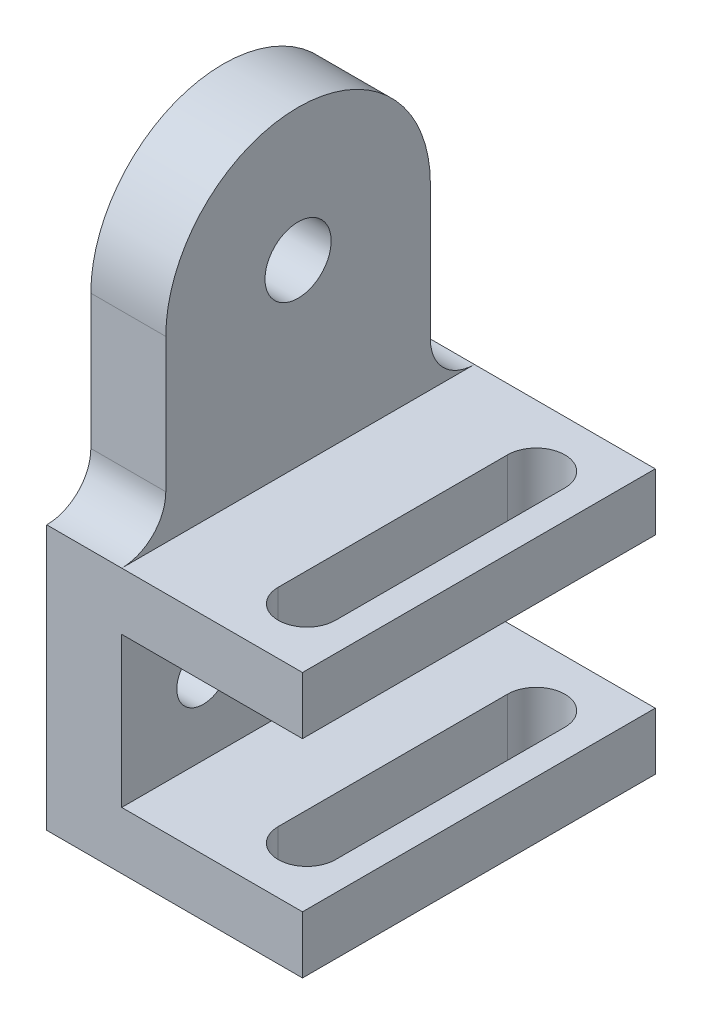
ISO-10303-21;
HEADER;
FILE_DESCRIPTION(('STEP AP214'),'2;1');
FILE_NAME('part.step','',(''),(''),'','','');
FILE_SCHEMA(('AUTOMOTIVE_DESIGN { 1 0 10303 214 1 1 1 1 }'));
ENDSEC;
DATA;
#1=APPLICATION_CONTEXT('core data for automotive mechanical design processes');
#2=APPLICATION_PROTOCOL_DEFINITION('international standard','automotive_design',2000,#1);
#3=PRODUCT_CONTEXT('',#1,'mechanical');
#4=PRODUCT('Part','Part','',(#3));
#5=PRODUCT_RELATED_PRODUCT_CATEGORY('part','',(#4));
#6=PRODUCT_DEFINITION_FORMATION('','',#4);
#7=PRODUCT_DEFINITION_CONTEXT('part definition',#1,'design');
#8=PRODUCT_DEFINITION('design','',#6,#7);
#9=PRODUCT_DEFINITION_SHAPE('','',#8);
#10=(LENGTH_UNIT() NAMED_UNIT(*) SI_UNIT(.MILLI.,.METRE.));
#11=(NAMED_UNIT(*) PLANE_ANGLE_UNIT() SI_UNIT($,.RADIAN.));
#12=(NAMED_UNIT(*) SI_UNIT($,.STERADIAN.) SOLID_ANGLE_UNIT());
#13=UNCERTAINTY_MEASURE_WITH_UNIT(LENGTH_MEASURE(1.E-05),#10,'distance_accuracy_value','');
#14=(GEOMETRIC_REPRESENTATION_CONTEXT(3) GLOBAL_UNCERTAINTY_ASSIGNED_CONTEXT((#13)) GLOBAL_UNIT_ASSIGNED_CONTEXT((#10,
#11,#12)) REPRESENTATION_CONTEXT('',''));
#15=CARTESIAN_POINT('',(0.,0.,0.));
#16=DIRECTION('',(0.,0.,1.));
#17=DIRECTION('',(1.,0.,0.));
#18=AXIS2_PLACEMENT_3D('',#15,#16,#17);
#19=CARTESIAN_POINT('',(17.,0.,0.));
#20=DIRECTION('',(0.,0.,-1.));
#21=DIRECTION('',(-1.,0.,0.));
#22=AXIS2_PLACEMENT_3D('',#19,#20,#21);
#23=PLANE('',#22);
#24=DIRECTION('',(0.,-1.,0.));
#25=VECTOR('',#24,1.);
#26=CARTESIAN_POINT('',(0.,0.,0.));
#27=LINE('',#26,#25);
#28=CARTESIAN_POINT('',(0.,0.,0.));
#29=VERTEX_POINT('',#28);
#30=CARTESIAN_POINT('',(0.,-60.,0.));
#31=VERTEX_POINT('',#30);
#32=EDGE_CURVE('E156',#29,#31,#27,.T.);
#33=ORIENTED_EDGE('',*,*,#32,.T.);
#34=DIRECTION('',(-1.,0.,0.));
#35=VECTOR('',#34,1.);
#36=CARTESIAN_POINT('',(17.,-60.,0.));
#37=LINE('',#36,#35);
#38=CARTESIAN_POINT('',(17.,-60.,0.));
#39=VERTEX_POINT('',#38);
#40=EDGE_CURVE('E12',#39,#31,#37,.T.);
#41=ORIENTED_EDGE('',*,*,#40,.F.);
#42=DIRECTION('',(0.,-1.,0.));
#43=VECTOR('',#42,1.);
#44=CARTESIAN_POINT('',(17.,0.,0.));
#45=LINE('',#44,#43);
#46=CARTESIAN_POINT('',(17.,0.,0.));
#47=VERTEX_POINT('',#46);
#48=EDGE_CURVE('E67',#47,#39,#45,.T.);
#49=ORIENTED_EDGE('',*,*,#48,.F.);
#50=DIRECTION('',(-1.,0.,0.));
#51=VECTOR('',#50,1.);
#52=CARTESIAN_POINT('',(17.,0.,0.));
#53=LINE('',#52,#51);
#54=EDGE_CURVE('E52',#47,#29,#53,.T.);
#55=ORIENTED_EDGE('',*,*,#54,.T.);
#56=EDGE_LOOP('',(#33,#41,#49,#55));
#57=FACE_BOUND('',#56,.T.);
#58=ADVANCED_FACE('F49',(#57),#23,.F.);
#59=CARTESIAN_POINT('',(17.,-60.,0.));
#60=DIRECTION('',(0.,-1.,0.));
#61=DIRECTION('',(1.,0.,0.));
#62=AXIS2_PLACEMENT_3D('',#59,#60,#61);
#63=PLANE('',#62);
#64=DIRECTION('',(0.,0.,1.));
#65=VECTOR('',#64,1.);
#66=CARTESIAN_POINT('',(0.,-60.,0.));
#67=LINE('',#66,#65);
#68=CARTESIAN_POINT('',(0.,-60.,-40.));
#69=VERTEX_POINT('',#68);
#70=EDGE_CURVE('E173',#69,#31,#67,.T.);
#71=ORIENTED_EDGE('',*,*,#70,.F.);
#72=DIRECTION('',(-1.,0.,0.));
#73=VECTOR('',#72,1.);
#74=CARTESIAN_POINT('',(17.,-60.,-40.));
#75=LINE('',#74,#73);
#76=CARTESIAN_POINT('',(17.,-60.,-40.));
#77=VERTEX_POINT('',#76);
#78=EDGE_CURVE('E58',#77,#69,#75,.T.);
#79=ORIENTED_EDGE('',*,*,#78,.F.);
#80=DIRECTION('',(0.,0.,1.));
#81=VECTOR('',#80,1.);
#82=CARTESIAN_POINT('',(17.,-60.,0.));
#83=LINE('',#82,#81);
#84=EDGE_CURVE('E145',#77,#39,#83,.T.);
#85=ORIENTED_EDGE('',*,*,#84,.T.);
#86=ORIENTED_EDGE('',*,*,#40,.T.);
#87=EDGE_LOOP('',(#71,#79,#85,#86));
#88=FACE_BOUND('',#87,.T.);
#89=ADVANCED_FACE('F202',(#88),#63,.T.);
#90=CARTESIAN_POINT('',(17.,0.,-40.));
#91=DIRECTION('',(0.,0.,-1.));
#92=DIRECTION('',(-1.,0.,0.));
#93=AXIS2_PLACEMENT_3D('',#90,#91,#92);
#94=PLANE('',#93);
#95=DIRECTION('',(0.,-1.,0.));
#96=VECTOR('',#95,1.);
#97=CARTESIAN_POINT('',(0.,0.,-40.));
#98=LINE('',#97,#96);
#99=CARTESIAN_POINT('',(0.,0.,-40.));
#100=VERTEX_POINT('',#99);
#101=EDGE_CURVE('E130',#100,#69,#98,.T.);
#102=ORIENTED_EDGE('',*,*,#101,.F.);
#103=DIRECTION('',(-1.,0.,0.));
#104=VECTOR('',#103,1.);
#105=CARTESIAN_POINT('',(17.,0.,-40.));
#106=LINE('',#105,#104);
#107=CARTESIAN_POINT('',(17.,0.,-40.));
#108=VERTEX_POINT('',#107);
#109=EDGE_CURVE('E125',#108,#100,#106,.T.);
#110=ORIENTED_EDGE('',*,*,#109,.F.);
#111=DIRECTION('',(0.,-1.,0.));
#112=VECTOR('',#111,1.);
#113=CARTESIAN_POINT('',(17.,0.,-40.));
#114=LINE('',#113,#112);
#115=EDGE_CURVE('E129',#108,#77,#114,.T.);
#116=ORIENTED_EDGE('',*,*,#115,.T.);
#117=ORIENTED_EDGE('',*,*,#78,.T.);
#118=EDGE_LOOP('',(#102,#110,#116,#117));
#119=FACE_BOUND('',#118,.T.);
#120=ADVANCED_FACE('F127',(#119),#94,.T.);
#121=CARTESIAN_POINT('',(17.,10.,-40.));
#122=DIRECTION('',(-1.,0.,0.));
#123=DIRECTION('',(0.,-1.,0.));
#124=AXIS2_PLACEMENT_3D('',#121,#122,#123);
#125=CYLINDRICAL_SURFACE('',#124,9.99999999999999);
#126=CARTESIAN_POINT('',(0.,10.,-40.));
#127=DIRECTION('',(-1.,0.,0.));
#128=DIRECTION('',(0.,-1.,0.));
#129=AXIS2_PLACEMENT_3D('',#126,#127,#128);
#130=CIRCLE('',#129,9.99999999999999);
#131=CARTESIAN_POINT('',(0.,10.0000000000001,-30.));
#132=VERTEX_POINT('',#131);
#133=EDGE_CURVE('E170',#100,#132,#130,.T.);
#134=ORIENTED_EDGE('',*,*,#133,.T.);
#135=DIRECTION('',(-1.,0.,0.));
#136=VECTOR('',#135,1.);
#137=CARTESIAN_POINT('',(17.,10.0000000000001,-30.));
#138=LINE('',#137,#136);
#139=CARTESIAN_POINT('',(17.,10.0000000000001,-30.));
#140=VERTEX_POINT('',#139);
#141=EDGE_CURVE('E134',#140,#132,#138,.T.);
#142=ORIENTED_EDGE('',*,*,#141,.F.);
#143=CARTESIAN_POINT('',(17.,10.,-40.));
#144=DIRECTION('',(-1.,0.,0.));
#145=DIRECTION('',(0.,-1.,0.));
#146=AXIS2_PLACEMENT_3D('',#143,#144,#145);
#147=CIRCLE('',#146,9.99999999999999);
#148=EDGE_CURVE('E137',#108,#140,#147,.T.);
#149=ORIENTED_EDGE('',*,*,#148,.F.);
#150=ORIENTED_EDGE('',*,*,#109,.T.);
#151=EDGE_LOOP('',(#134,#142,#149,#150));
#152=FACE_BOUND('',#151,.T.);
#153=ADVANCED_FACE('F138',(#152),#125,.F.);
#154=CARTESIAN_POINT('',(17.,0.,-30.));
#155=DIRECTION('',(0.,0.,-1.));
#156=DIRECTION('',(-1.,0.,0.));
#157=AXIS2_PLACEMENT_3D('',#154,#155,#156);
#158=PLANE('',#157);
#159=DIRECTION('',(0.,-1.,0.));
#160=VECTOR('',#159,1.);
#161=CARTESIAN_POINT('',(0.,0.,-30.));
#162=LINE('',#161,#160);
#163=CARTESIAN_POINT('',(0.,40.5,-30.));
#164=VERTEX_POINT('',#163);
#165=EDGE_CURVE('E167',#164,#132,#162,.T.);
#166=ORIENTED_EDGE('',*,*,#165,.F.);
#167=DIRECTION('',(-1.,0.,0.));
#168=VECTOR('',#167,1.);
#169=CARTESIAN_POINT('',(17.,40.5,-30.));
#170=LINE('',#169,#168);
#171=CARTESIAN_POINT('',(17.,40.5,-30.));
#172=VERTEX_POINT('',#171);
#173=EDGE_CURVE('E184',#172,#164,#170,.T.);
#174=ORIENTED_EDGE('',*,*,#173,.F.);
#175=DIRECTION('',(0.,-1.,0.));
#176=VECTOR('',#175,1.);
#177=CARTESIAN_POINT('',(17.,0.,-30.));
#178=LINE('',#177,#176);
#179=EDGE_CURVE('E141',#172,#140,#178,.T.);
#180=ORIENTED_EDGE('',*,*,#179,.T.);
#181=ORIENTED_EDGE('',*,*,#141,.T.);
#182=EDGE_LOOP('',(#166,#174,#180,#181));
#183=FACE_BOUND('',#182,.T.);
#184=ADVANCED_FACE('F216',(#183),#158,.T.);
#185=CARTESIAN_POINT('',(17.,40.5,0.));
#186=DIRECTION('',(-1.,0.,0.));
#187=DIRECTION('',(0.,-1.,0.));
#188=AXIS2_PLACEMENT_3D('',#185,#186,#187);
#189=CYLINDRICAL_SURFACE('',#188,30.);
#190=CARTESIAN_POINT('',(0.,40.5,0.));
#191=DIRECTION('',(-1.,0.,0.));
#192=DIRECTION('',(0.,-1.,0.));
#193=AXIS2_PLACEMENT_3D('',#190,#191,#192);
#194=CIRCLE('',#193,30.);
#195=CARTESIAN_POINT('',(0.,40.5,30.));
#196=VERTEX_POINT('',#195);
#197=EDGE_CURVE('E164',#196,#164,#194,.T.);
#198=ORIENTED_EDGE('',*,*,#197,.F.);
#199=DIRECTION('',(-1.,0.,0.));
#200=VECTOR('',#199,1.);
#201=CARTESIAN_POINT('',(17.,40.5,30.));
#202=LINE('',#201,#200);
#203=CARTESIAN_POINT('',(17.,40.5,30.));
#204=VERTEX_POINT('',#203);
#205=EDGE_CURVE('E186',#204,#196,#202,.T.);
#206=ORIENTED_EDGE('',*,*,#205,.F.);
#207=CARTESIAN_POINT('',(17.,40.5,0.));
#208=DIRECTION('',(-1.,0.,0.));
#209=DIRECTION('',(0.,-1.,0.));
#210=AXIS2_PLACEMENT_3D('',#207,#208,#209);
#211=CIRCLE('',#210,30.);
#212=EDGE_CURVE('E369',#204,#172,#211,.T.);
#213=ORIENTED_EDGE('',*,*,#212,.T.);
#214=ORIENTED_EDGE('',*,*,#173,.T.);
#215=EDGE_LOOP('',(#198,#206,#213,#214));
#216=FACE_BOUND('',#215,.T.);
#217=ADVANCED_FACE('F219',(#216),#189,.T.);
#218=CARTESIAN_POINT('',(17.,0.,30.));
#219=DIRECTION('',(0.,0.,-1.));
#220=DIRECTION('',(0.,1.,0.));
#221=AXIS2_PLACEMENT_3D('',#218,#219,#220);
#222=PLANE('',#221);
#223=DIRECTION('',(0.,-1.,0.));
#224=VECTOR('',#223,1.);
#225=CARTESIAN_POINT('',(0.,0.,30.));
#226=LINE('',#225,#224);
#227=CARTESIAN_POINT('',(0.,10.0000000000001,30.));
#228=VERTEX_POINT('',#227);
#229=EDGE_CURVE('E162',#196,#228,#226,.T.);
#230=ORIENTED_EDGE('',*,*,#229,.T.);
#231=DIRECTION('',(-1.,0.,0.));
#232=VECTOR('',#231,1.);
#233=CARTESIAN_POINT('',(17.,10.0000000000001,30.));
#234=LINE('',#233,#232);
#235=CARTESIAN_POINT('',(17.,10.0000000000001,30.));
#236=VERTEX_POINT('',#235);
#237=EDGE_CURVE('E188',#236,#228,#234,.T.);
#238=ORIENTED_EDGE('',*,*,#237,.F.);
#239=DIRECTION('',(0.,-1.,0.));
#240=VECTOR('',#239,1.);
#241=CARTESIAN_POINT('',(17.,0.,30.));
#242=LINE('',#241,#240);
#243=EDGE_CURVE('E370',#204,#236,#242,.T.);
#244=ORIENTED_EDGE('',*,*,#243,.F.);
#245=ORIENTED_EDGE('',*,*,#205,.T.);
#246=EDGE_LOOP('',(#230,#238,#244,#245));
#247=FACE_BOUND('',#246,.T.);
#248=ADVANCED_FACE('F223',(#247),#222,.F.);
#249=CARTESIAN_POINT('',(17.,10.,40.));
#250=DIRECTION('',(-1.,0.,0.));
#251=DIRECTION('',(0.,-1.,0.));
#252=AXIS2_PLACEMENT_3D('',#249,#250,#251);
#253=CYLINDRICAL_SURFACE('',#252,10.);
#254=CARTESIAN_POINT('',(0.,10.,40.));
#255=DIRECTION('',(-1.,0.,0.));
#256=DIRECTION('',(0.,-1.,0.));
#257=AXIS2_PLACEMENT_3D('',#254,#255,#256);
#258=CIRCLE('',#257,10.);
#259=CARTESIAN_POINT('',(0.,0.,40.));
#260=VERTEX_POINT('',#259);
#261=EDGE_CURVE('E160',#228,#260,#258,.T.);
#262=ORIENTED_EDGE('',*,*,#261,.T.);
#263=DIRECTION('',(-1.,0.,0.));
#264=VECTOR('',#263,1.);
#265=CARTESIAN_POINT('',(17.,0.,40.));
#266=LINE('',#265,#264);
#267=CARTESIAN_POINT('',(17.,0.,40.));
#268=VERTEX_POINT('',#267);
#269=EDGE_CURVE('E190',#268,#260,#266,.T.);
#270=ORIENTED_EDGE('',*,*,#269,.F.);
#271=CARTESIAN_POINT('',(17.,10.,40.));
#272=DIRECTION('',(-1.,0.,0.));
#273=DIRECTION('',(0.,-1.,0.));
#274=AXIS2_PLACEMENT_3D('',#271,#272,#273);
#275=CIRCLE('',#274,10.);
#276=EDGE_CURVE('E374',#236,#268,#275,.T.);
#277=ORIENTED_EDGE('',*,*,#276,.F.);
#278=ORIENTED_EDGE('',*,*,#237,.T.);
#279=EDGE_LOOP('',(#262,#270,#277,#278));
#280=FACE_BOUND('',#279,.T.);
#281=ADVANCED_FACE('F227',(#280),#253,.F.);
#282=CARTESIAN_POINT('',(17.,-30.,-21.5));
#283=DIRECTION('',(-1.,0.,0.));
#284=DIRECTION('',(0.,-1.,0.));
#285=AXIS2_PLACEMENT_3D('',#282,#283,#284);
#286=CYLINDRICAL_SURFACE('',#285,6.);
#287=CARTESIAN_POINT('',(17.,-30.,-21.5));
#288=DIRECTION('',(-1.,0.,0.));
#289=DIRECTION('',(0.,-1.,0.));
#290=AXIS2_PLACEMENT_3D('',#287,#288,#289);
#291=CIRCLE('',#290,6.);
#292=CARTESIAN_POINT('',(17.,-36.,-21.5));
#293=VERTEX_POINT('',#292);
#294=EDGE_CURVE('E147',#293,#293,#291,.T.);
#295=ORIENTED_EDGE('',*,*,#294,.F.);
#296=EDGE_LOOP('',(#295));
#297=FACE_BOUND('',#296,.T.);
#298=CARTESIAN_POINT('',(0.,-30.,-21.5));
#299=DIRECTION('',(-1.,0.,0.));
#300=DIRECTION('',(0.,-1.,0.));
#301=AXIS2_PLACEMENT_3D('',#298,#299,#300);
#302=CIRCLE('',#301,6.);
#303=CARTESIAN_POINT('',(0.,-36.,-21.5));
#304=VERTEX_POINT('',#303);
#305=EDGE_CURVE('E176',#304,#304,#302,.T.);
#306=ORIENTED_EDGE('',*,*,#305,.T.);
#307=EDGE_LOOP('',(#306));
#308=FACE_BOUND('',#307,.T.);
#309=ADVANCED_FACE('F211',(#297,#308),#286,.F.);
#310=CARTESIAN_POINT('',(17.,0.,0.));
#311=DIRECTION('',(0.,1.,0.));
#312=DIRECTION('',(-1.,0.,0.));
#313=AXIS2_PLACEMENT_3D('',#310,#311,#312);
#314=PLANE('',#313);
#315=DIRECTION('',(0.,0.,-1.));
#316=VECTOR('',#315,1.);
#317=CARTESIAN_POINT('',(0.,0.,0.));
#318=LINE('',#317,#316);
#319=EDGE_CURVE('E158',#260,#29,#318,.T.);
#320=ORIENTED_EDGE('',*,*,#319,.T.);
#321=ORIENTED_EDGE('',*,*,#54,.F.);
#322=DIRECTION('',(0.,0.,-1.));
#323=VECTOR('',#322,1.);
#324=CARTESIAN_POINT('',(17.,0.,0.));
#325=LINE('',#324,#323);
#326=EDGE_CURVE('E109',#268,#47,#325,.T.);
#327=ORIENTED_EDGE('',*,*,#326,.F.);
#328=ORIENTED_EDGE('',*,*,#269,.T.);
#329=EDGE_LOOP('',(#320,#321,#327,#328));
#330=FACE_BOUND('',#329,.T.);
#331=ADVANCED_FACE('F231',(#330),#314,.F.);
#332=CARTESIAN_POINT('',(17.,40.5,0.));
#333=DIRECTION('',(-1.,0.,0.));
#334=DIRECTION('',(0.,-1.,0.));
#335=AXIS2_PLACEMENT_3D('',#332,#333,#334);
#336=CYLINDRICAL_SURFACE('',#335,7.5);
#337=CARTESIAN_POINT('',(17.,40.5,0.));
#338=DIRECTION('',(-1.,0.,0.));
#339=DIRECTION('',(0.,-1.,0.));
#340=AXIS2_PLACEMENT_3D('',#337,#338,#339);
#341=CIRCLE('',#340,7.5);
#342=CARTESIAN_POINT('',(17.,33.,0.));
#343=VERTEX_POINT('',#342);
#344=EDGE_CURVE('E153',#343,#343,#341,.T.);
#345=ORIENTED_EDGE('',*,*,#344,.F.);
#346=EDGE_LOOP('',(#345));
#347=FACE_BOUND('',#346,.T.);
#348=CARTESIAN_POINT('',(0.,40.5,0.));
#349=DIRECTION('',(-1.,0.,0.));
#350=DIRECTION('',(0.,-1.,0.));
#351=AXIS2_PLACEMENT_3D('',#348,#349,#350);
#352=CIRCLE('',#351,7.5);
#353=CARTESIAN_POINT('',(0.,33.,0.));
#354=VERTEX_POINT('',#353);
#355=EDGE_CURVE('E179',#354,#354,#352,.T.);
#356=ORIENTED_EDGE('',*,*,#355,.T.);
#357=EDGE_LOOP('',(#356));
#358=FACE_BOUND('',#357,.T.);
#359=ADVANCED_FACE('F233',(#347,#358),#336,.F.);
#360=CARTESIAN_POINT('',(17.,0.,0.));
#361=DIRECTION('',(-1.,0.,0.));
#362=DIRECTION('',(0.,-1.,0.));
#363=AXIS2_PLACEMENT_3D('',#360,#361,#362);
#364=PLANE('',#363);
#365=ORIENTED_EDGE('',*,*,#48,.T.);
#366=ORIENTED_EDGE('',*,*,#84,.F.);
#367=ORIENTED_EDGE('',*,*,#115,.F.);
#368=ORIENTED_EDGE('',*,*,#148,.T.);
#369=ORIENTED_EDGE('',*,*,#179,.F.);
#370=ORIENTED_EDGE('',*,*,#212,.F.);
#371=ORIENTED_EDGE('',*,*,#243,.T.);
#372=ORIENTED_EDGE('',*,*,#276,.T.);
#373=ORIENTED_EDGE('',*,*,#326,.T.);
#374=EDGE_LOOP('',(#365,#366,#367,#368,#369,#370,#371,#372,#373));
#375=FACE_BOUND('',#374,.T.);
#376=ORIENTED_EDGE('',*,*,#294,.T.);
#377=EDGE_LOOP('',(#376));
#378=FACE_BOUND('',#377,.T.);
#379=ORIENTED_EDGE('',*,*,#344,.T.);
#380=EDGE_LOOP('',(#379));
#381=FACE_BOUND('',#380,.T.);
#382=ADVANCED_FACE('F143',(#375,#378,#381),#364,.F.);
#383=CARTESIAN_POINT('',(0.,0.,0.));
#384=DIRECTION('',(-1.,0.,0.));
#385=DIRECTION('',(0.,-1.,0.));
#386=AXIS2_PLACEMENT_3D('',#383,#384,#385);
#387=PLANE('',#386);
#388=ORIENTED_EDGE('',*,*,#32,.F.);
#389=ORIENTED_EDGE('',*,*,#319,.F.);
#390=ORIENTED_EDGE('',*,*,#261,.F.);
#391=ORIENTED_EDGE('',*,*,#229,.F.);
#392=ORIENTED_EDGE('',*,*,#197,.T.);
#393=ORIENTED_EDGE('',*,*,#165,.T.);
#394=ORIENTED_EDGE('',*,*,#133,.F.);
#395=ORIENTED_EDGE('',*,*,#101,.T.);
#396=ORIENTED_EDGE('',*,*,#70,.T.);
#397=EDGE_LOOP('',(#388,#389,#390,#391,#392,#393,#394,#395,#396));
#398=FACE_BOUND('',#397,.T.);
#399=ORIENTED_EDGE('',*,*,#305,.F.);
#400=EDGE_LOOP('',(#399));
#401=FACE_BOUND('',#400,.T.);
#402=ORIENTED_EDGE('',*,*,#355,.F.);
#403=EDGE_LOOP('',(#402));
#404=FACE_BOUND('',#403,.T.);
#405=ADVANCED_FACE('F199',(#398,#401,#404),#387,.T.);
#406=CLOSED_SHELL('',(#58,#89,#120,#153,#184,#217,#248,#281,#309,#331,#359,#382,#405));
#407=MANIFOLD_SOLID_BREP('B2',#406);
#408=CARTESIAN_POINT('',(58.,0.,40.));
#409=DIRECTION('',(0.,-1.,0.));
#410=DIRECTION('',(1.,0.,0.));
#411=AXIS2_PLACEMENT_3D('',#408,#409,#410);
#412=PLANE('',#411);
#413=CARTESIAN_POINT('',(45.,0.,26.));
#414=DIRECTION('',(0.,1.,0.));
#415=DIRECTION('',(-1.,0.,0.));
#416=AXIS2_PLACEMENT_3D('',#413,#414,#415);
#417=CIRCLE('',#416,6.50000000000001);
#418=CARTESIAN_POINT('',(38.5,0.,26.));
#419=VERTEX_POINT('',#418);
#420=CARTESIAN_POINT('',(51.5,0.,26.));
#421=VERTEX_POINT('',#420);
#422=EDGE_CURVE('E526',#419,#421,#417,.T.);
#423=ORIENTED_EDGE('',*,*,#422,.F.);
#424=DIRECTION('',(0.,0.,1.));
#425=VECTOR('',#424,1.);
#426=CARTESIAN_POINT('',(38.5,0.,0.));
#427=LINE('',#426,#425);
#428=CARTESIAN_POINT('',(38.5,0.,-26.));
#429=VERTEX_POINT('',#428);
#430=EDGE_CURVE('E394',#429,#419,#427,.T.);
#431=ORIENTED_EDGE('',*,*,#430,.F.);
#432=CARTESIAN_POINT('',(45.,0.,-26.));
#433=DIRECTION('',(0.,1.,0.));
#434=DIRECTION('',(-1.,0.,0.));
#435=AXIS2_PLACEMENT_3D('',#432,#433,#434);
#436=CIRCLE('',#435,6.50000000000001);
#437=CARTESIAN_POINT('',(51.5,0.,-26.));
#438=VERTEX_POINT('',#437);
#439=EDGE_CURVE('E517',#438,#429,#436,.T.);
#440=ORIENTED_EDGE('',*,*,#439,.F.);
#441=DIRECTION('',(0.,0.,1.));
#442=VECTOR('',#441,1.);
#443=CARTESIAN_POINT('',(51.5,0.,0.));
#444=LINE('',#443,#442);
#445=EDGE_CURVE('E520',#438,#421,#444,.T.);
#446=ORIENTED_EDGE('',*,*,#445,.T.);
#447=EDGE_LOOP('',(#423,#431,#440,#446));
#448=FACE_BOUND('',#447,.T.);
#449=DIRECTION('',(-1.,0.,0.));
#450=VECTOR('',#449,1.);
#451=CARTESIAN_POINT('',(58.,0.,-40.));
#452=LINE('',#451,#450);
#453=CARTESIAN_POINT('',(58.,0.,-40.));
#454=VERTEX_POINT('',#453);
#455=CARTESIAN_POINT('',(0.,0.,-40.));
#456=VERTEX_POINT('',#455);
#457=EDGE_CURVE('E573',#454,#456,#452,.T.);
#458=ORIENTED_EDGE('',*,*,#457,.T.);
#459=DIRECTION('',(0.,0.,-1.));
#460=VECTOR('',#459,1.);
#461=CARTESIAN_POINT('',(0.,0.,40.));
#462=LINE('',#461,#460);
#463=CARTESIAN_POINT('',(0.,0.,40.));
#464=VERTEX_POINT('',#463);
#465=EDGE_CURVE('E610',#464,#456,#462,.T.);
#466=ORIENTED_EDGE('',*,*,#465,.F.);
#467=DIRECTION('',(-1.,0.,0.));
#468=VECTOR('',#467,1.);
#469=CARTESIAN_POINT('',(58.,0.,40.));
#470=LINE('',#469,#468);
#471=CARTESIAN_POINT('',(58.,0.,40.));
#472=VERTEX_POINT('',#471);
#473=EDGE_CURVE('E554',#472,#464,#470,.T.);
#474=ORIENTED_EDGE('',*,*,#473,.F.);
#475=DIRECTION('',(0.,0.,-1.));
#476=VECTOR('',#475,1.);
#477=CARTESIAN_POINT('',(58.,0.,40.));
#478=LINE('',#477,#476);
#479=EDGE_CURVE('E572',#472,#454,#478,.T.);
#480=ORIENTED_EDGE('',*,*,#479,.T.);
#481=EDGE_LOOP('',(#458,#466,#474,#480));
#482=FACE_BOUND('',#481,.T.);
#483=ADVANCED_FACE('F380',(#448,#482),#412,.F.);
#484=CARTESIAN_POINT('',(0.,0.,40.));
#485=DIRECTION('',(1.,0.,0.));
#486=DIRECTION('',(0.,1.,0.));
#487=AXIS2_PLACEMENT_3D('',#484,#485,#486);
#488=PLANE('',#487);
#489=CARTESIAN_POINT('',(0.,-30.,-21.5));
#490=DIRECTION('',(-1.,0.,0.));
#491=DIRECTION('',(0.,-1.,0.));
#492=AXIS2_PLACEMENT_3D('',#489,#490,#491);
#493=CIRCLE('',#492,6.);
#494=CARTESIAN_POINT('',(0.,-36.,-21.5));
#495=VERTEX_POINT('',#494);
#496=EDGE_CURVE('E548',#495,#495,#493,.T.);
#497=ORIENTED_EDGE('',*,*,#496,.F.);
#498=EDGE_LOOP('',(#497));
#499=FACE_BOUND('',#498,.T.);
#500=CARTESIAN_POINT('',(0.,-30.,21.5));
#501=DIRECTION('',(-1.,0.,0.));
#502=DIRECTION('',(0.,-1.,0.));
#503=AXIS2_PLACEMENT_3D('',#500,#501,#502);
#504=CIRCLE('',#503,6.);
#505=CARTESIAN_POINT('',(0.,-36.,21.5));
#506=VERTEX_POINT('',#505);
#507=EDGE_CURVE('E547',#506,#506,#504,.T.);
#508=ORIENTED_EDGE('',*,*,#507,.F.);
#509=EDGE_LOOP('',(#508));
#510=FACE_BOUND('',#509,.T.);
#511=DIRECTION('',(0.,-1.,0.));
#512=VECTOR('',#511,1.);
#513=CARTESIAN_POINT('',(0.,0.,-40.));
#514=LINE('',#513,#512);
#515=CARTESIAN_POINT('',(0.,-60.,-40.));
#516=VERTEX_POINT('',#515);
#517=EDGE_CURVE('E576',#456,#516,#514,.T.);
#518=ORIENTED_EDGE('',*,*,#517,.T.);
#519=DIRECTION('',(0.,0.,-1.));
#520=VECTOR('',#519,1.);
#521=CARTESIAN_POINT('',(0.,-60.,40.));
#522=LINE('',#521,#520);
#523=CARTESIAN_POINT('',(0.,-60.,40.));
#524=VERTEX_POINT('',#523);
#525=EDGE_CURVE('E607',#524,#516,#522,.T.);
#526=ORIENTED_EDGE('',*,*,#525,.F.);
#527=DIRECTION('',(0.,-1.,0.));
#528=VECTOR('',#527,1.);
#529=CARTESIAN_POINT('',(0.,0.,40.));
#530=LINE('',#529,#528);
#531=EDGE_CURVE('E557',#464,#524,#530,.T.);
#532=ORIENTED_EDGE('',*,*,#531,.F.);
#533=ORIENTED_EDGE('',*,*,#465,.T.);
#534=EDGE_LOOP('',(#518,#526,#532,#533));
#535=FACE_BOUND('',#534,.T.);
#536=ADVANCED_FACE('F652',(#499,#510,#535),#488,.F.);
#537=CARTESIAN_POINT('',(0.,-60.,40.));
#538=DIRECTION('',(0.,1.,0.));
#539=DIRECTION('',(0.,0.,1.));
#540=AXIS2_PLACEMENT_3D('',#537,#538,#539);
#541=PLANE('',#540);
#542=CARTESIAN_POINT('',(45.,-60.,-26.));
#543=DIRECTION('',(0.,1.,0.));
#544=DIRECTION('',(-1.,0.,0.));
#545=AXIS2_PLACEMENT_3D('',#542,#543,#544);
#546=CIRCLE('',#545,6.50000000000001);
#547=CARTESIAN_POINT('',(51.5,-60.,-26.));
#548=VERTEX_POINT('',#547);
#549=CARTESIAN_POINT('',(38.5,-60.,-26.));
#550=VERTEX_POINT('',#549);
#551=EDGE_CURVE('E516',#548,#550,#546,.T.);
#552=ORIENTED_EDGE('',*,*,#551,.T.);
#553=DIRECTION('',(0.,0.,1.));
#554=VECTOR('',#553,1.);
#555=CARTESIAN_POINT('',(38.5,-60.,0.));
#556=LINE('',#555,#554);
#557=CARTESIAN_POINT('',(38.5,-60.,26.));
#558=VERTEX_POINT('',#557);
#559=EDGE_CURVE('E498',#550,#558,#556,.T.);
#560=ORIENTED_EDGE('',*,*,#559,.T.);
#561=CARTESIAN_POINT('',(45.,-60.,26.));
#562=DIRECTION('',(0.,1.,0.));
#563=DIRECTION('',(-1.,0.,0.));
#564=AXIS2_PLACEMENT_3D('',#561,#562,#563);
#565=CIRCLE('',#564,6.50000000000001);
#566=CARTESIAN_POINT('',(51.5,-60.,26.));
#567=VERTEX_POINT('',#566);
#568=EDGE_CURVE('E507',#558,#567,#565,.T.);
#569=ORIENTED_EDGE('',*,*,#568,.T.);
#570=DIRECTION('',(0.,0.,1.));
#571=VECTOR('',#570,1.);
#572=CARTESIAN_POINT('',(51.5,-60.,0.));
#573=LINE('',#572,#571);
#574=EDGE_CURVE('E511',#548,#567,#573,.T.);
#575=ORIENTED_EDGE('',*,*,#574,.F.);
#576=EDGE_LOOP('',(#552,#560,#569,#575));
#577=FACE_BOUND('',#576,.T.);
#578=DIRECTION('',(1.,0.,0.));
#579=VECTOR('',#578,1.);
#580=CARTESIAN_POINT('',(0.,-60.,-40.));
#581=LINE('',#580,#579);
#582=CARTESIAN_POINT('',(58.,-60.,-40.));
#583=VERTEX_POINT('',#582);
#584=EDGE_CURVE('E579',#516,#583,#581,.T.);
#585=ORIENTED_EDGE('',*,*,#584,.T.);
#586=DIRECTION('',(0.,0.,-1.));
#587=VECTOR('',#586,1.);
#588=CARTESIAN_POINT('',(58.,-60.,40.));
#589=LINE('',#588,#587);
#590=CARTESIAN_POINT('',(58.,-60.,40.));
#591=VERTEX_POINT('',#590);
#592=EDGE_CURVE('E604',#591,#583,#589,.T.);
#593=ORIENTED_EDGE('',*,*,#592,.F.);
#594=DIRECTION('',(1.,0.,0.));
#595=VECTOR('',#594,1.);
#596=CARTESIAN_POINT('',(0.,-60.,40.));
#597=LINE('',#596,#595);
#598=EDGE_CURVE('E560',#524,#591,#597,.T.);
#599=ORIENTED_EDGE('',*,*,#598,.F.);
#600=ORIENTED_EDGE('',*,*,#525,.T.);
#601=EDGE_LOOP('',(#585,#593,#599,#600));
#602=FACE_BOUND('',#601,.T.);
#603=ADVANCED_FACE('F513',(#577,#602),#541,.F.);
#604=CARTESIAN_POINT('',(58.,-60.,40.));
#605=DIRECTION('',(-1.,0.,0.));
#606=DIRECTION('',(0.,-1.,0.));
#607=AXIS2_PLACEMENT_3D('',#604,#605,#606);
#608=PLANE('',#607);
#609=DIRECTION('',(0.,1.,0.));
#610=VECTOR('',#609,1.);
#611=CARTESIAN_POINT('',(58.,-60.,-40.));
#612=LINE('',#611,#610);
#613=CARTESIAN_POINT('',(58.,-47.,-40.));
#614=VERTEX_POINT('',#613);
#615=EDGE_CURVE('E581',#583,#614,#612,.T.);
#616=ORIENTED_EDGE('',*,*,#615,.T.);
#617=DIRECTION('',(0.,0.,-1.));
#618=VECTOR('',#617,1.);
#619=CARTESIAN_POINT('',(58.,-47.,40.));
#620=LINE('',#619,#618);
#621=CARTESIAN_POINT('',(58.,-47.,40.));
#622=VERTEX_POINT('',#621);
#623=EDGE_CURVE('E601',#622,#614,#620,.T.);
#624=ORIENTED_EDGE('',*,*,#623,.F.);
#625=DIRECTION('',(0.,1.,0.));
#626=VECTOR('',#625,1.);
#627=CARTESIAN_POINT('',(58.,-60.,40.));
#628=LINE('',#627,#626);
#629=EDGE_CURVE('E562',#591,#622,#628,.T.);
#630=ORIENTED_EDGE('',*,*,#629,.F.);
#631=ORIENTED_EDGE('',*,*,#592,.T.);
#632=EDGE_LOOP('',(#616,#624,#630,#631));
#633=FACE_BOUND('',#632,.T.);
#634=ADVANCED_FACE('F660',(#633),#608,.F.);
#635=CARTESIAN_POINT('',(58.,-47.,40.));
#636=DIRECTION('',(0.,-1.,0.));
#637=DIRECTION('',(1.,0.,0.));
#638=AXIS2_PLACEMENT_3D('',#635,#636,#637);
#639=PLANE('',#638);
#640=CARTESIAN_POINT('',(45.,-47.,26.));
#641=DIRECTION('',(0.,-1.,0.));
#642=DIRECTION('',(1.,0.,0.));
#643=AXIS2_PLACEMENT_3D('',#640,#641,#642);
#644=CIRCLE('',#643,6.50000000000001);
#645=CARTESIAN_POINT('',(51.5,-47.,26.));
#646=VERTEX_POINT('',#645);
#647=CARTESIAN_POINT('',(38.5,-47.,26.));
#648=VERTEX_POINT('',#647);
#649=EDGE_CURVE('E533',#646,#648,#644,.T.);
#650=ORIENTED_EDGE('',*,*,#649,.T.);
#651=DIRECTION('',(0.,0.,-1.));
#652=VECTOR('',#651,1.);
#653=CARTESIAN_POINT('',(38.5,-47.,40.));
#654=LINE('',#653,#652);
#655=CARTESIAN_POINT('',(38.5,-47.,-26.));
#656=VERTEX_POINT('',#655);
#657=EDGE_CURVE('E501',#648,#656,#654,.T.);
#658=ORIENTED_EDGE('',*,*,#657,.T.);
#659=CARTESIAN_POINT('',(45.,-47.,-26.));
#660=DIRECTION('',(0.,-1.,0.));
#661=DIRECTION('',(1.,0.,0.));
#662=AXIS2_PLACEMENT_3D('',#659,#660,#661);
#663=CIRCLE('',#662,6.50000000000001);
#664=CARTESIAN_POINT('',(51.5,-47.,-26.));
#665=VERTEX_POINT('',#664);
#666=EDGE_CURVE('E543',#656,#665,#663,.T.);
#667=ORIENTED_EDGE('',*,*,#666,.T.);
#668=DIRECTION('',(0.,0.,-1.));
#669=VECTOR('',#668,1.);
#670=CARTESIAN_POINT('',(51.5,-47.,40.));
#671=LINE('',#670,#669);
#672=EDGE_CURVE('E541',#646,#665,#671,.T.);
#673=ORIENTED_EDGE('',*,*,#672,.F.);
#674=EDGE_LOOP('',(#650,#658,#667,#673));
#675=FACE_BOUND('',#674,.T.);
#676=DIRECTION('',(-1.,0.,0.));
#677=VECTOR('',#676,1.);
#678=CARTESIAN_POINT('',(58.,-47.,-40.));
#679=LINE('',#678,#677);
#680=CARTESIAN_POINT('',(17.,-47.,-40.));
#681=VERTEX_POINT('',#680);
#682=EDGE_CURVE('E583',#614,#681,#679,.T.);
#683=ORIENTED_EDGE('',*,*,#682,.T.);
#684=DIRECTION('',(0.,0.,-1.));
#685=VECTOR('',#684,1.);
#686=CARTESIAN_POINT('',(17.,-47.,40.));
#687=LINE('',#686,#685);
#688=CARTESIAN_POINT('',(17.,-47.,40.));
#689=VERTEX_POINT('',#688);
#690=EDGE_CURVE('E598',#689,#681,#687,.T.);
#691=ORIENTED_EDGE('',*,*,#690,.F.);
#692=DIRECTION('',(-1.,0.,0.));
#693=VECTOR('',#692,1.);
#694=CARTESIAN_POINT('',(58.,-47.,40.));
#695=LINE('',#694,#693);
#696=EDGE_CURVE('E564',#622,#689,#695,.T.);
#697=ORIENTED_EDGE('',*,*,#696,.F.);
#698=ORIENTED_EDGE('',*,*,#623,.T.);
#699=EDGE_LOOP('',(#683,#691,#697,#698));
#700=FACE_BOUND('',#699,.T.);
#701=ADVANCED_FACE('F667',(#675,#700),#639,.F.);
#702=CARTESIAN_POINT('',(17.,-47.,40.));
#703=DIRECTION('',(-1.,0.,0.));
#704=DIRECTION('',(0.,0.,1.));
#705=AXIS2_PLACEMENT_3D('',#702,#703,#704);
#706=PLANE('',#705);
#707=CARTESIAN_POINT('',(17.,-30.,-21.5));
#708=DIRECTION('',(-1.,0.,0.));
#709=DIRECTION('',(0.,0.,1.));
#710=AXIS2_PLACEMENT_3D('',#707,#708,#709);
#711=CIRCLE('',#710,6.);
#712=CARTESIAN_POINT('',(17.,-30.,-15.5));
#713=VERTEX_POINT('',#712);
#714=EDGE_CURVE('E577',#713,#713,#711,.T.);
#715=ORIENTED_EDGE('',*,*,#714,.T.);
#716=EDGE_LOOP('',(#715));
#717=FACE_BOUND('',#716,.T.);
#718=CARTESIAN_POINT('',(17.,-30.,21.5));
#719=DIRECTION('',(-1.,0.,0.));
#720=DIRECTION('',(0.,0.,1.));
#721=AXIS2_PLACEMENT_3D('',#718,#719,#720);
#722=CIRCLE('',#721,6.);
#723=CARTESIAN_POINT('',(17.,-30.,27.5));
#724=VERTEX_POINT('',#723);
#725=EDGE_CURVE('E551',#724,#724,#722,.T.);
#726=ORIENTED_EDGE('',*,*,#725,.T.);
#727=EDGE_LOOP('',(#726));
#728=FACE_BOUND('',#727,.T.);
#729=DIRECTION('',(0.,1.,0.));
#730=VECTOR('',#729,1.);
#731=CARTESIAN_POINT('',(17.,-47.,-40.));
#732=LINE('',#731,#730);
#733=CARTESIAN_POINT('',(17.,-13.,-40.));
#734=VERTEX_POINT('',#733);
#735=EDGE_CURVE('E585',#681,#734,#732,.T.);
#736=ORIENTED_EDGE('',*,*,#735,.T.);
#737=DIRECTION('',(0.,0.,-1.));
#738=VECTOR('',#737,1.);
#739=CARTESIAN_POINT('',(17.,-13.,40.));
#740=LINE('',#739,#738);
#741=CARTESIAN_POINT('',(17.,-13.,40.));
#742=VERTEX_POINT('',#741);
#743=EDGE_CURVE('E595',#742,#734,#740,.T.);
#744=ORIENTED_EDGE('',*,*,#743,.F.);
#745=DIRECTION('',(0.,1.,0.));
#746=VECTOR('',#745,1.);
#747=CARTESIAN_POINT('',(17.,-47.,40.));
#748=LINE('',#747,#746);
#749=EDGE_CURVE('E566',#689,#742,#748,.T.);
#750=ORIENTED_EDGE('',*,*,#749,.F.);
#751=ORIENTED_EDGE('',*,*,#690,.T.);
#752=EDGE_LOOP('',(#736,#744,#750,#751));
#753=FACE_BOUND('',#752,.T.);
#754=ADVANCED_FACE('F671',(#717,#728,#753),#706,.F.);
#755=CARTESIAN_POINT('',(17.,-13.,40.));
#756=DIRECTION('',(0.,1.,0.));
#757=DIRECTION('',(-1.,0.,0.));
#758=AXIS2_PLACEMENT_3D('',#755,#756,#757);
#759=PLANE('',#758);
#760=CARTESIAN_POINT('',(45.,-13.,-26.));
#761=DIRECTION('',(0.,1.,0.));
#762=DIRECTION('',(-1.,0.,0.));
#763=AXIS2_PLACEMENT_3D('',#760,#761,#762);
#764=CIRCLE('',#763,6.50000000000001);
#765=CARTESIAN_POINT('',(51.5,-13.,-26.));
#766=VERTEX_POINT('',#765);
#767=CARTESIAN_POINT('',(38.5,-13.,-26.));
#768=VERTEX_POINT('',#767);
#769=EDGE_CURVE('E387',#766,#768,#764,.T.);
#770=ORIENTED_EDGE('',*,*,#769,.T.);
#771=DIRECTION('',(0.,0.,1.));
#772=VECTOR('',#771,1.);
#773=CARTESIAN_POINT('',(38.5,-13.,40.));
#774=LINE('',#773,#772);
#775=CARTESIAN_POINT('',(38.5,-13.,26.));
#776=VERTEX_POINT('',#775);
#777=EDGE_CURVE('E47',#768,#776,#774,.T.);
#778=ORIENTED_EDGE('',*,*,#777,.T.);
#779=CARTESIAN_POINT('',(45.,-13.,26.));
#780=DIRECTION('',(0.,1.,0.));
#781=DIRECTION('',(-1.,0.,0.));
#782=AXIS2_PLACEMENT_3D('',#779,#780,#781);
#783=CIRCLE('',#782,6.50000000000001);
#784=CARTESIAN_POINT('',(51.5,-13.,26.));
#785=VERTEX_POINT('',#784);
#786=EDGE_CURVE('E613',#776,#785,#783,.T.);
#787=ORIENTED_EDGE('',*,*,#786,.T.);
#788=DIRECTION('',(0.,0.,1.));
#789=VECTOR('',#788,1.);
#790=CARTESIAN_POINT('',(51.5,-13.,40.));
#791=LINE('',#790,#789);
#792=EDGE_CURVE('E620',#766,#785,#791,.T.);
#793=ORIENTED_EDGE('',*,*,#792,.F.);
#794=EDGE_LOOP('',(#770,#778,#787,#793));
#795=FACE_BOUND('',#794,.T.);
#796=DIRECTION('',(1.,0.,0.));
#797=VECTOR('',#796,1.);
#798=CARTESIAN_POINT('',(17.,-13.,-40.));
#799=LINE('',#798,#797);
#800=CARTESIAN_POINT('',(58.,-13.,-40.));
#801=VERTEX_POINT('',#800);
#802=EDGE_CURVE('E587',#734,#801,#799,.T.);
#803=ORIENTED_EDGE('',*,*,#802,.T.);
#804=DIRECTION('',(0.,0.,-1.));
#805=VECTOR('',#804,1.);
#806=CARTESIAN_POINT('',(58.,-13.,40.));
#807=LINE('',#806,#805);
#808=CARTESIAN_POINT('',(58.,-13.,40.));
#809=VERTEX_POINT('',#808);
#810=EDGE_CURVE('E592',#809,#801,#807,.T.);
#811=ORIENTED_EDGE('',*,*,#810,.F.);
#812=DIRECTION('',(1.,0.,0.));
#813=VECTOR('',#812,1.);
#814=CARTESIAN_POINT('',(17.,-13.,40.));
#815=LINE('',#814,#813);
#816=EDGE_CURVE('E568',#742,#809,#815,.T.);
#817=ORIENTED_EDGE('',*,*,#816,.F.);
#818=ORIENTED_EDGE('',*,*,#743,.T.);
#819=EDGE_LOOP('',(#803,#811,#817,#818));
#820=FACE_BOUND('',#819,.T.);
#821=ADVANCED_FACE('F625',(#795,#820),#759,.F.);
#822=CARTESIAN_POINT('',(58.,-13.,40.));
#823=DIRECTION('',(-1.,0.,0.));
#824=DIRECTION('',(0.,0.,1.));
#825=AXIS2_PLACEMENT_3D('',#822,#823,#824);
#826=PLANE('',#825);
#827=DIRECTION('',(0.,1.,0.));
#828=VECTOR('',#827,1.);
#829=CARTESIAN_POINT('',(58.,-13.,-40.));
#830=LINE('',#829,#828);
#831=EDGE_CURVE('E558',#801,#454,#830,.T.);
#832=ORIENTED_EDGE('',*,*,#831,.T.);
#833=ORIENTED_EDGE('',*,*,#479,.F.);
#834=DIRECTION('',(0.,1.,0.));
#835=VECTOR('',#834,1.);
#836=CARTESIAN_POINT('',(58.,-13.,40.));
#837=LINE('',#836,#835);
#838=EDGE_CURVE('E570',#809,#472,#837,.T.);
#839=ORIENTED_EDGE('',*,*,#838,.F.);
#840=ORIENTED_EDGE('',*,*,#810,.T.);
#841=EDGE_LOOP('',(#832,#833,#839,#840));
#842=FACE_BOUND('',#841,.T.);
#843=ADVANCED_FACE('F678',(#842),#826,.F.);
#844=CARTESIAN_POINT('',(0.,0.,40.));
#845=DIRECTION('',(0.,0.,1.));
#846=DIRECTION('',(1.,0.,0.));
#847=AXIS2_PLACEMENT_3D('',#844,#845,#846);
#848=PLANE('',#847);
#849=ORIENTED_EDGE('',*,*,#473,.T.);
#850=ORIENTED_EDGE('',*,*,#531,.T.);
#851=ORIENTED_EDGE('',*,*,#598,.T.);
#852=ORIENTED_EDGE('',*,*,#629,.T.);
#853=ORIENTED_EDGE('',*,*,#696,.T.);
#854=ORIENTED_EDGE('',*,*,#749,.T.);
#855=ORIENTED_EDGE('',*,*,#816,.T.);
#856=ORIENTED_EDGE('',*,*,#838,.T.);
#857=EDGE_LOOP('',(#849,#850,#851,#852,#853,#854,#855,#856));
#858=FACE_BOUND('',#857,.T.);
#859=ADVANCED_FACE('F681',(#858),#848,.T.);
#860=CARTESIAN_POINT('',(0.,0.,-40.));
#861=DIRECTION('',(0.,0.,1.));
#862=DIRECTION('',(1.,0.,0.));
#863=AXIS2_PLACEMENT_3D('',#860,#861,#862);
#864=PLANE('',#863);
#865=ORIENTED_EDGE('',*,*,#457,.F.);
#866=ORIENTED_EDGE('',*,*,#831,.F.);
#867=ORIENTED_EDGE('',*,*,#802,.F.);
#868=ORIENTED_EDGE('',*,*,#735,.F.);
#869=ORIENTED_EDGE('',*,*,#682,.F.);
#870=ORIENTED_EDGE('',*,*,#615,.F.);
#871=ORIENTED_EDGE('',*,*,#584,.F.);
#872=ORIENTED_EDGE('',*,*,#517,.F.);
#873=EDGE_LOOP('',(#865,#866,#867,#868,#869,#870,#871,#872));
#874=FACE_BOUND('',#873,.T.);
#875=ADVANCED_FACE('F683',(#874),#864,.F.);
#876=CARTESIAN_POINT('',(80.,-30.,21.5));
#877=DIRECTION('',(-1.,0.,0.));
#878=DIRECTION('',(0.,-1.,0.));
#879=AXIS2_PLACEMENT_3D('',#876,#877,#878);
#880=CYLINDRICAL_SURFACE('',#879,6.);
#881=ORIENTED_EDGE('',*,*,#507,.T.);
#882=EDGE_LOOP('',(#881));
#883=FACE_BOUND('',#882,.T.);
#884=ORIENTED_EDGE('',*,*,#725,.F.);
#885=EDGE_LOOP('',(#884));
#886=FACE_BOUND('',#885,.T.);
#887=ADVANCED_FACE('F686',(#883,#886),#880,.F.);
#888=CARTESIAN_POINT('',(80.,-30.,-21.5));
#889=DIRECTION('',(-1.,0.,0.));
#890=DIRECTION('',(0.,-1.,0.));
#891=AXIS2_PLACEMENT_3D('',#888,#889,#890);
#892=CYLINDRICAL_SURFACE('',#891,6.);
#893=ORIENTED_EDGE('',*,*,#496,.T.);
#894=EDGE_LOOP('',(#893));
#895=FACE_BOUND('',#894,.T.);
#896=ORIENTED_EDGE('',*,*,#714,.F.);
#897=EDGE_LOOP('',(#896));
#898=FACE_BOUND('',#897,.T.);
#899=ADVANCED_FACE('F692',(#895,#898),#892,.F.);
#900=CARTESIAN_POINT('',(45.,-60.,26.));
#901=DIRECTION('',(0.,1.,0.));
#902=DIRECTION('',(-1.,0.,0.));
#903=AXIS2_PLACEMENT_3D('',#900,#901,#902);
#904=CYLINDRICAL_SURFACE('',#903,6.50000000000001);
#905=DIRECTION('',(0.,1.,0.));
#906=VECTOR('',#905,1.);
#907=CARTESIAN_POINT('',(38.5,-60.,26.));
#908=LINE('',#907,#906);
#909=EDGE_CURVE('E504',#776,#419,#908,.T.);
#910=ORIENTED_EDGE('',*,*,#909,.T.);
#911=ORIENTED_EDGE('',*,*,#422,.T.);
#912=DIRECTION('',(0.,1.,0.));
#913=VECTOR('',#912,1.);
#914=CARTESIAN_POINT('',(51.5,-60.,26.));
#915=LINE('',#914,#913);
#916=EDGE_CURVE('E503',#785,#421,#915,.T.);
#917=ORIENTED_EDGE('',*,*,#916,.F.);
#918=ORIENTED_EDGE('',*,*,#786,.F.);
#919=EDGE_LOOP('',(#910,#911,#917,#918));
#920=FACE_BOUND('',#919,.T.);
#921=ADVANCED_FACE('F639',(#920),#904,.F.);
#922=CARTESIAN_POINT('',(51.5,-60.,0.));
#923=DIRECTION('',(-1.,0.,0.));
#924=DIRECTION('',(0.,-1.,0.));
#925=AXIS2_PLACEMENT_3D('',#922,#923,#924);
#926=PLANE('',#925);
#927=ORIENTED_EDGE('',*,*,#792,.T.);
#928=ORIENTED_EDGE('',*,*,#916,.T.);
#929=ORIENTED_EDGE('',*,*,#445,.F.);
#930=DIRECTION('',(0.,1.,0.));
#931=VECTOR('',#930,1.);
#932=CARTESIAN_POINT('',(51.5,-60.,-26.));
#933=LINE('',#932,#931);
#934=EDGE_CURVE('E538',#766,#438,#933,.T.);
#935=ORIENTED_EDGE('',*,*,#934,.F.);
#936=EDGE_LOOP('',(#927,#928,#929,#935));
#937=FACE_BOUND('',#936,.T.);
#938=ADVANCED_FACE('F633',(#937),#926,.T.);
#939=CARTESIAN_POINT('',(45.,-60.,-26.));
#940=DIRECTION('',(0.,1.,0.));
#941=DIRECTION('',(-1.,0.,0.));
#942=AXIS2_PLACEMENT_3D('',#939,#940,#941);
#943=CYLINDRICAL_SURFACE('',#942,6.50000000000001);
#944=ORIENTED_EDGE('',*,*,#934,.T.);
#945=ORIENTED_EDGE('',*,*,#439,.T.);
#946=DIRECTION('',(0.,1.,0.));
#947=VECTOR('',#946,1.);
#948=CARTESIAN_POINT('',(38.5,-60.,-26.));
#949=LINE('',#948,#947);
#950=EDGE_CURVE('E534',#768,#429,#949,.T.);
#951=ORIENTED_EDGE('',*,*,#950,.F.);
#952=ORIENTED_EDGE('',*,*,#769,.F.);
#953=EDGE_LOOP('',(#944,#945,#951,#952));
#954=FACE_BOUND('',#953,.T.);
#955=ADVANCED_FACE('F630',(#954),#943,.F.);
#956=CARTESIAN_POINT('',(38.5,-60.,0.));
#957=DIRECTION('',(-1.,0.,0.));
#958=DIRECTION('',(0.,-1.,0.));
#959=AXIS2_PLACEMENT_3D('',#956,#957,#958);
#960=PLANE('',#959);
#961=ORIENTED_EDGE('',*,*,#950,.T.);
#962=ORIENTED_EDGE('',*,*,#430,.T.);
#963=ORIENTED_EDGE('',*,*,#909,.F.);
#964=ORIENTED_EDGE('',*,*,#777,.F.);
#965=EDGE_LOOP('',(#961,#962,#963,#964));
#966=FACE_BOUND('',#965,.T.);
#967=ADVANCED_FACE('F640',(#966),#960,.F.);
#968=EDGE_CURVE('E494',#558,#648,#908,.T.);
#969=ORIENTED_EDGE('',*,*,#968,.F.);
#970=ORIENTED_EDGE('',*,*,#559,.F.);
#971=EDGE_CURVE('E531',#550,#656,#949,.T.);
#972=ORIENTED_EDGE('',*,*,#971,.T.);
#973=ORIENTED_EDGE('',*,*,#657,.F.);
#974=EDGE_LOOP('',(#969,#970,#972,#973));
#975=FACE_BOUND('',#974,.T.);
#976=ADVANCED_FACE('F495',(#975),#960,.F.);
#977=ORIENTED_EDGE('',*,*,#971,.F.);
#978=ORIENTED_EDGE('',*,*,#551,.F.);
#979=EDGE_CURVE('E535',#548,#665,#933,.T.);
#980=ORIENTED_EDGE('',*,*,#979,.T.);
#981=ORIENTED_EDGE('',*,*,#666,.F.);
#982=EDGE_LOOP('',(#977,#978,#980,#981));
#983=FACE_BOUND('',#982,.T.);
#984=ADVANCED_FACE('F647',(#983),#943,.F.);
#985=ORIENTED_EDGE('',*,*,#672,.T.);
#986=ORIENTED_EDGE('',*,*,#979,.F.);
#987=ORIENTED_EDGE('',*,*,#574,.T.);
#988=EDGE_CURVE('E402',#567,#646,#915,.T.);
#989=ORIENTED_EDGE('',*,*,#988,.T.);
#990=EDGE_LOOP('',(#985,#986,#987,#989));
#991=FACE_BOUND('',#990,.T.);
#992=ADVANCED_FACE('F733',(#991),#926,.T.);
#993=ORIENTED_EDGE('',*,*,#988,.F.);
#994=ORIENTED_EDGE('',*,*,#568,.F.);
#995=ORIENTED_EDGE('',*,*,#968,.T.);
#996=ORIENTED_EDGE('',*,*,#649,.F.);
#997=EDGE_LOOP('',(#993,#994,#995,#996));
#998=FACE_BOUND('',#997,.T.);
#999=ADVANCED_FACE('F508',(#998),#904,.F.);
#1000=CLOSED_SHELL('',(#483,#536,#603,#634,#701,#754,#821,#843,#859,#875,#887,#899,#921,#938,
#955,#967,#976,#984,#992,#999));
#1001=MANIFOLD_SOLID_BREP('B6',#1000);
#1002=ADVANCED_BREP_SHAPE_REPRESENTATION('',(#18,#407,#1001),#14);
#1003=SHAPE_DEFINITION_REPRESENTATION(#9,#1002);
ENDSEC;
END-ISO-10303-21;
